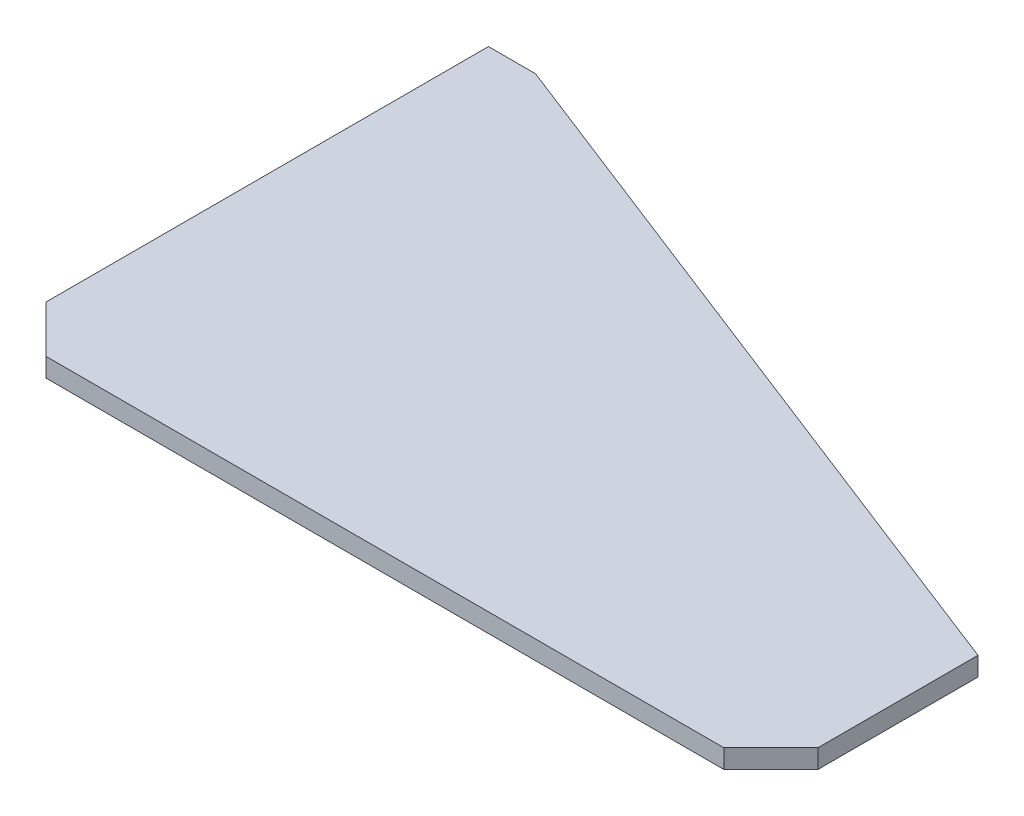
ISO-10303-21;
HEADER;
FILE_DESCRIPTION(('STEP AP214'),'2;1');
FILE_NAME('part.step','',(''),(''),'','','');
FILE_SCHEMA(('AUTOMOTIVE_DESIGN { 1 0 10303 214 1 1 1 1 }'));
ENDSEC;
DATA;
#1=APPLICATION_CONTEXT('core data for automotive mechanical design processes');
#2=APPLICATION_PROTOCOL_DEFINITION('international standard','automotive_design',2000,#1);
#3=PRODUCT_CONTEXT('',#1,'mechanical');
#4=PRODUCT('Part','Part','',(#3));
#5=PRODUCT_RELATED_PRODUCT_CATEGORY('part','',(#4));
#6=PRODUCT_DEFINITION_FORMATION('','',#4);
#7=PRODUCT_DEFINITION_CONTEXT('part definition',#1,'design');
#8=PRODUCT_DEFINITION('design','',#6,#7);
#9=PRODUCT_DEFINITION_SHAPE('','',#8);
#10=(LENGTH_UNIT() NAMED_UNIT(*) SI_UNIT(.MILLI.,.METRE.));
#11=(NAMED_UNIT(*) PLANE_ANGLE_UNIT() SI_UNIT($,.RADIAN.));
#12=(NAMED_UNIT(*) SI_UNIT($,.STERADIAN.) SOLID_ANGLE_UNIT());
#13=UNCERTAINTY_MEASURE_WITH_UNIT(LENGTH_MEASURE(1.E-05),#10,'distance_accuracy_value','');
#14=(GEOMETRIC_REPRESENTATION_CONTEXT(3) GLOBAL_UNCERTAINTY_ASSIGNED_CONTEXT((#13)) GLOBAL_UNIT_ASSIGNED_CONTEXT((#10,
#11,#12)) REPRESENTATION_CONTEXT('',''));
#15=CARTESIAN_POINT('',(0.,0.,0.));
#16=DIRECTION('',(0.,0.,1.));
#17=DIRECTION('',(1.,0.,0.));
#18=AXIS2_PLACEMENT_3D('',#15,#16,#17);
#19=CARTESIAN_POINT('',(0.,-1.,-52.));
#20=DIRECTION('',(0.,0.,1.));
#21=DIRECTION('',(1.,0.,0.));
#22=AXIS2_PLACEMENT_3D('',#19,#20,#21);
#23=PLANE('',#22);
#24=DIRECTION('',(0.,1.,0.));
#25=VECTOR('',#24,1.);
#26=CARTESIAN_POINT('',(0.,-1.,-52.));
#27=LINE('',#26,#25);
#28=CARTESIAN_POINT('',(0.,-1.,-52.));
#29=VERTEX_POINT('',#28);
#30=CARTESIAN_POINT('',(0.,1.,-52.));
#31=VERTEX_POINT('',#30);
#32=EDGE_CURVE('E135',#29,#31,#27,.T.);
#33=ORIENTED_EDGE('',*,*,#32,.T.);
#34=DIRECTION('',(1.,0.,0.));
#35=VECTOR('',#34,1.);
#36=CARTESIAN_POINT('',(0.,1.,-52.));
#37=LINE('',#36,#35);
#38=CARTESIAN_POINT('',(5.,1.,-52.));
#39=VERTEX_POINT('',#38);
#40=EDGE_CURVE('E128',#31,#39,#37,.T.);
#41=ORIENTED_EDGE('',*,*,#40,.T.);
#42=DIRECTION('',(0.,1.,0.));
#43=VECTOR('',#42,1.);
#44=CARTESIAN_POINT('',(5.,-1.,-52.));
#45=LINE('',#44,#43);
#46=CARTESIAN_POINT('',(5.,-1.,-52.));
#47=VERTEX_POINT('',#46);
#48=EDGE_CURVE('E110',#47,#39,#45,.T.);
#49=ORIENTED_EDGE('',*,*,#48,.F.);
#50=DIRECTION('',(1.,0.,0.));
#51=VECTOR('',#50,1.);
#52=CARTESIAN_POINT('',(0.,-1.,-52.));
#53=LINE('',#52,#51);
#54=EDGE_CURVE('E136',#29,#47,#53,.T.);
#55=ORIENTED_EDGE('',*,*,#54,.F.);
#56=EDGE_LOOP('',(#33,#41,#49,#55));
#57=FACE_BOUND('',#56,.T.);
#58=ADVANCED_FACE('F44',(#57),#23,.F.);
#59=CARTESIAN_POINT('',(5.,-1.,-52.));
#60=DIRECTION('',(-0.363030152721553,0.,0.931777391985321));
#61=DIRECTION('',(0.931777391985321,0.,0.363030152721553));
#62=AXIS2_PLACEMENT_3D('',#59,#60,#61);
#63=PLANE('',#62);
#64=ORIENTED_EDGE('',*,*,#48,.T.);
#65=DIRECTION('',(0.93177739198532,0.,0.363030152721553));
#66=VECTOR('',#65,1.);
#67=CARTESIAN_POINT('',(5.,1.,-52.));
#68=LINE('',#67,#66);
#69=CARTESIAN_POINT('',(82.,1.,-22.));
#70=VERTEX_POINT('',#69);
#71=EDGE_CURVE('E111',#39,#70,#68,.T.);
#72=ORIENTED_EDGE('',*,*,#71,.T.);
#73=DIRECTION('',(0.,1.,0.));
#74=VECTOR('',#73,1.);
#75=CARTESIAN_POINT('',(82.,-1.,-22.));
#76=LINE('',#75,#74);
#77=CARTESIAN_POINT('',(82.,-1.,-22.));
#78=VERTEX_POINT('',#77);
#79=EDGE_CURVE('E118',#78,#70,#76,.T.);
#80=ORIENTED_EDGE('',*,*,#79,.F.);
#81=DIRECTION('',(0.93177739198532,0.,0.363030152721553));
#82=VECTOR('',#81,1.);
#83=CARTESIAN_POINT('',(5.,-1.,-52.));
#84=LINE('',#83,#82);
#85=EDGE_CURVE('E113',#47,#78,#84,.T.);
#86=ORIENTED_EDGE('',*,*,#85,.F.);
#87=EDGE_LOOP('',(#64,#72,#80,#86));
#88=FACE_BOUND('',#87,.T.);
#89=ADVANCED_FACE('F107',(#88),#63,.F.);
#90=CARTESIAN_POINT('',(82.,-1.,0.));
#91=DIRECTION('',(1.,0.,0.));
#92=DIRECTION('',(0.,0.,-1.));
#93=AXIS2_PLACEMENT_3D('',#90,#91,#92);
#94=PLANE('',#93);
#95=DIRECTION('',(0.,0.,-1.));
#96=VECTOR('',#95,1.);
#97=CARTESIAN_POINT('',(82.,1.,0.));
#98=LINE('',#97,#96);
#99=CARTESIAN_POINT('',(82.,1.,-5.00000000000009));
#100=VERTEX_POINT('',#99);
#101=EDGE_CURVE('E130',#100,#70,#98,.T.);
#102=ORIENTED_EDGE('',*,*,#101,.F.);
#103=DIRECTION('',(0.,-1.,0.));
#104=VECTOR('',#103,1.);
#105=CARTESIAN_POINT('',(82.,-1.,-5.00000000000009));
#106=LINE('',#105,#104);
#107=CARTESIAN_POINT('',(82.,-1.,-5.00000000000009));
#108=VERTEX_POINT('',#107);
#109=EDGE_CURVE('E67',#100,#108,#106,.T.);
#110=ORIENTED_EDGE('',*,*,#109,.T.);
#111=DIRECTION('',(0.,0.,-1.));
#112=VECTOR('',#111,1.);
#113=CARTESIAN_POINT('',(82.,-1.,0.));
#114=LINE('',#113,#112);
#115=EDGE_CURVE('E141',#108,#78,#114,.T.);
#116=ORIENTED_EDGE('',*,*,#115,.T.);
#117=ORIENTED_EDGE('',*,*,#79,.T.);
#118=EDGE_LOOP('',(#102,#110,#116,#117));
#119=FACE_BOUND('',#118,.T.);
#120=ADVANCED_FACE('F167',(#119),#94,.T.);
#121=CARTESIAN_POINT('',(0.,-1.,0.));
#122=DIRECTION('',(0.,0.,1.));
#123=DIRECTION('',(1.,0.,0.));
#124=AXIS2_PLACEMENT_3D('',#121,#122,#123);
#125=PLANE('',#124);
#126=DIRECTION('',(1.,0.,0.));
#127=VECTOR('',#126,1.);
#128=CARTESIAN_POINT('',(0.,-1.,0.));
#129=LINE('',#128,#127);
#130=CARTESIAN_POINT('',(5.00000000000009,-1.,0.));
#131=VERTEX_POINT('',#130);
#132=CARTESIAN_POINT('',(77.,-1.,0.));
#133=VERTEX_POINT('',#132);
#134=EDGE_CURVE('E143',#131,#133,#129,.T.);
#135=ORIENTED_EDGE('',*,*,#134,.T.);
#136=DIRECTION('',(0.,1.,0.));
#137=VECTOR('',#136,1.);
#138=CARTESIAN_POINT('',(77.,-1.,0.));
#139=LINE('',#138,#137);
#140=CARTESIAN_POINT('',(77.,1.,0.));
#141=VERTEX_POINT('',#140);
#142=EDGE_CURVE('E153',#133,#141,#139,.T.);
#143=ORIENTED_EDGE('',*,*,#142,.T.);
#144=DIRECTION('',(1.,0.,0.));
#145=VECTOR('',#144,1.);
#146=CARTESIAN_POINT('',(0.,1.,0.));
#147=LINE('',#146,#145);
#148=CARTESIAN_POINT('',(5.00000000000009,1.,0.));
#149=VERTEX_POINT('',#148);
#150=EDGE_CURVE('E137',#149,#141,#147,.T.);
#151=ORIENTED_EDGE('',*,*,#150,.F.);
#152=DIRECTION('',(0.,-1.,0.));
#153=VECTOR('',#152,1.);
#154=CARTESIAN_POINT('',(5.00000000000009,-1.,0.));
#155=LINE('',#154,#153);
#156=EDGE_CURVE('E117',#149,#131,#155,.T.);
#157=ORIENTED_EDGE('',*,*,#156,.T.);
#158=EDGE_LOOP('',(#135,#143,#151,#157));
#159=FACE_BOUND('',#158,.T.);
#160=ADVANCED_FACE('F168',(#159),#125,.T.);
#161=CARTESIAN_POINT('',(0.,-1.,0.));
#162=DIRECTION('',(1.,0.,0.));
#163=DIRECTION('',(0.,0.,-1.));
#164=AXIS2_PLACEMENT_3D('',#161,#162,#163);
#165=PLANE('',#164);
#166=DIRECTION('',(0.,0.,-1.));
#167=VECTOR('',#166,1.);
#168=CARTESIAN_POINT('',(0.,-1.,0.));
#169=LINE('',#168,#167);
#170=CARTESIAN_POINT('',(0.,-1.,-5.00000000000003));
#171=VERTEX_POINT('',#170);
#172=EDGE_CURVE('E146',#171,#29,#169,.T.);
#173=ORIENTED_EDGE('',*,*,#172,.F.);
#174=DIRECTION('',(0.,1.,0.));
#175=VECTOR('',#174,1.);
#176=CARTESIAN_POINT('',(0.,1.,-5.00000000000004));
#177=LINE('',#176,#175);
#178=CARTESIAN_POINT('',(0.,1.,-5.00000000000003));
#179=VERTEX_POINT('',#178);
#180=EDGE_CURVE('E11',#171,#179,#177,.T.);
#181=ORIENTED_EDGE('',*,*,#180,.T.);
#182=DIRECTION('',(0.,0.,-1.));
#183=VECTOR('',#182,1.);
#184=CARTESIAN_POINT('',(0.,1.,0.));
#185=LINE('',#184,#183);
#186=EDGE_CURVE('E138',#179,#31,#185,.T.);
#187=ORIENTED_EDGE('',*,*,#186,.T.);
#188=ORIENTED_EDGE('',*,*,#32,.F.);
#189=EDGE_LOOP('',(#173,#181,#187,#188));
#190=FACE_BOUND('',#189,.T.);
#191=ADVANCED_FACE('F173',(#190),#165,.F.);
#192=CARTESIAN_POINT('',(0.,-1.,0.));
#193=DIRECTION('',(0.,1.,0.));
#194=DIRECTION('',(0.,0.,1.));
#195=AXIS2_PLACEMENT_3D('',#192,#193,#194);
#196=PLANE('',#195);
#197=ORIENTED_EDGE('',*,*,#115,.F.);
#198=DIRECTION('',(0.707106781186544,0.,-0.707106781186551));
#199=VECTOR('',#198,1.);
#200=CARTESIAN_POINT('',(77.,-1.,0.));
#201=LINE('',#200,#199);
#202=EDGE_CURVE('E53',#108,#133,#201,.F.);
#203=ORIENTED_EDGE('',*,*,#202,.T.);
#204=ORIENTED_EDGE('',*,*,#134,.F.);
#205=DIRECTION('',(-0.707106781186551,0.,-0.707106781186544));
#206=VECTOR('',#205,1.);
#207=CARTESIAN_POINT('',(0.,-1.,-5.00000000000004));
#208=LINE('',#207,#206);
#209=EDGE_CURVE('E63',#131,#171,#208,.T.);
#210=ORIENTED_EDGE('',*,*,#209,.T.);
#211=ORIENTED_EDGE('',*,*,#172,.T.);
#212=ORIENTED_EDGE('',*,*,#54,.T.);
#213=ORIENTED_EDGE('',*,*,#85,.T.);
#214=EDGE_LOOP('',(#197,#203,#204,#210,#211,#212,#213));
#215=FACE_BOUND('',#214,.T.);
#216=ADVANCED_FACE('F162',(#215),#196,.F.);
#217=CARTESIAN_POINT('',(0.,1.,0.));
#218=DIRECTION('',(0.,1.,0.));
#219=DIRECTION('',(0.,0.,1.));
#220=AXIS2_PLACEMENT_3D('',#217,#218,#219);
#221=PLANE('',#220);
#222=ORIENTED_EDGE('',*,*,#150,.T.);
#223=DIRECTION('',(-0.707106781186544,0.,0.707106781186551));
#224=VECTOR('',#223,1.);
#225=CARTESIAN_POINT('',(38.5000000000004,1.,38.5));
#226=LINE('',#225,#224);
#227=EDGE_CURVE('E158',#141,#100,#226,.F.);
#228=ORIENTED_EDGE('',*,*,#227,.T.);
#229=ORIENTED_EDGE('',*,*,#101,.T.);
#230=ORIENTED_EDGE('',*,*,#71,.F.);
#231=ORIENTED_EDGE('',*,*,#40,.F.);
#232=ORIENTED_EDGE('',*,*,#186,.F.);
#233=DIRECTION('',(0.707106781186551,0.,0.707106781186544));
#234=VECTOR('',#233,1.);
#235=CARTESIAN_POINT('',(2.50000000000002,1.,-2.50000000000004));
#236=LINE('',#235,#234);
#237=EDGE_CURVE('E157',#179,#149,#236,.T.);
#238=ORIENTED_EDGE('',*,*,#237,.T.);
#239=EDGE_LOOP('',(#222,#228,#229,#230,#231,#232,#238));
#240=FACE_BOUND('',#239,.T.);
#241=ADVANCED_FACE('F121',(#240),#221,.T.);
#242=CARTESIAN_POINT('',(77.,-1.,0.));
#243=DIRECTION('',(-0.707106781186551,0.,-0.707106781186544));
#244=DIRECTION('',(0.,1.,0.));
#245=AXIS2_PLACEMENT_3D('',#242,#243,#244);
#246=PLANE('',#245);
#247=ORIENTED_EDGE('',*,*,#202,.F.);
#248=ORIENTED_EDGE('',*,*,#109,.F.);
#249=ORIENTED_EDGE('',*,*,#227,.F.);
#250=ORIENTED_EDGE('',*,*,#142,.F.);
#251=EDGE_LOOP('',(#247,#248,#249,#250));
#252=FACE_BOUND('',#251,.T.);
#253=ADVANCED_FACE('F169',(#252),#246,.F.);
#254=CARTESIAN_POINT('',(0.,-1.,-5.00000000000004));
#255=DIRECTION('',(-0.707106781186544,0.,0.707106781186551));
#256=DIRECTION('',(0.,-1.,0.));
#257=AXIS2_PLACEMENT_3D('',#254,#255,#256);
#258=PLANE('',#257);
#259=ORIENTED_EDGE('',*,*,#209,.F.);
#260=ORIENTED_EDGE('',*,*,#156,.F.);
#261=ORIENTED_EDGE('',*,*,#237,.F.);
#262=ORIENTED_EDGE('',*,*,#180,.F.);
#263=EDGE_LOOP('',(#259,#260,#261,#262));
#264=FACE_BOUND('',#263,.T.);
#265=ADVANCED_FACE('F48',(#264),#258,.T.);
#266=CLOSED_SHELL('',(#58,#89,#120,#160,#191,#216,#241,#253,#265));
#267=MANIFOLD_SOLID_BREP('B2',#266);
#268=ADVANCED_BREP_SHAPE_REPRESENTATION('',(#18,#267),#14);
#269=SHAPE_DEFINITION_REPRESENTATION(#9,#268);
ENDSEC;
END-ISO-10303-21;
